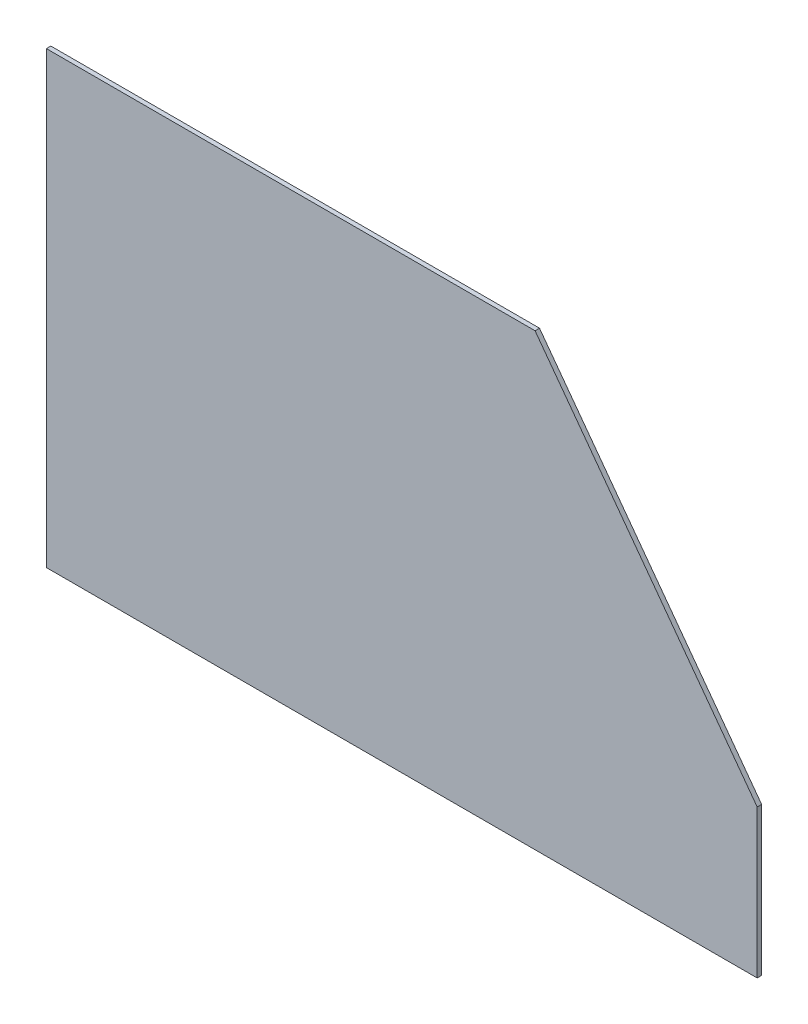
ISO-10303-21;
HEADER;
FILE_DESCRIPTION(('STEP AP214'),'2;1');
FILE_NAME('part.step','',(''),(''),'','','');
FILE_SCHEMA(('AUTOMOTIVE_DESIGN { 1 0 10303 214 1 1 1 1 }'));
ENDSEC;
DATA;
#1=APPLICATION_CONTEXT('core data for automotive mechanical design processes');
#2=APPLICATION_PROTOCOL_DEFINITION('international standard','automotive_design',2000,#1);
#3=PRODUCT_CONTEXT('',#1,'mechanical');
#4=PRODUCT('Part','Part','',(#3));
#5=PRODUCT_RELATED_PRODUCT_CATEGORY('part','',(#4));
#6=PRODUCT_DEFINITION_FORMATION('','',#4);
#7=PRODUCT_DEFINITION_CONTEXT('part definition',#1,'design');
#8=PRODUCT_DEFINITION('design','',#6,#7);
#9=PRODUCT_DEFINITION_SHAPE('','',#8);
#10=(LENGTH_UNIT() NAMED_UNIT(*) SI_UNIT(.MILLI.,.METRE.));
#11=(NAMED_UNIT(*) PLANE_ANGLE_UNIT() SI_UNIT($,.RADIAN.));
#12=(NAMED_UNIT(*) SI_UNIT($,.STERADIAN.) SOLID_ANGLE_UNIT());
#13=UNCERTAINTY_MEASURE_WITH_UNIT(LENGTH_MEASURE(1.E-05),#10,'distance_accuracy_value','');
#14=(GEOMETRIC_REPRESENTATION_CONTEXT(3) GLOBAL_UNCERTAINTY_ASSIGNED_CONTEXT((#13)) GLOBAL_UNIT_ASSIGNED_CONTEXT((#10,
#11,#12)) REPRESENTATION_CONTEXT('',''));
#15=CARTESIAN_POINT('',(0.,0.,0.));
#16=DIRECTION('',(0.,0.,1.));
#17=DIRECTION('',(1.,0.,0.));
#18=AXIS2_PLACEMENT_3D('',#15,#16,#17);
#19=CARTESIAN_POINT('',(0.,303.5,3.));
#20=DIRECTION('',(1.,0.,0.));
#21=DIRECTION('',(0.,1.,0.));
#22=AXIS2_PLACEMENT_3D('',#19,#20,#21);
#23=PLANE('',#22);
#24=DIRECTION('',(0.,-1.,0.));
#25=VECTOR('',#24,1.);
#26=CARTESIAN_POINT('',(0.,303.5,0.));
#27=LINE('',#26,#25);
#28=CARTESIAN_POINT('',(0.,303.5,0.));
#29=VERTEX_POINT('',#28);
#30=CARTESIAN_POINT('',(0.,0.,0.));
#31=VERTEX_POINT('',#30);
#32=EDGE_CURVE('E118',#29,#31,#27,.T.);
#33=ORIENTED_EDGE('',*,*,#32,.T.);
#34=DIRECTION('',(0.,0.,-1.));
#35=VECTOR('',#34,1.);
#36=CARTESIAN_POINT('',(0.,0.,3.));
#37=LINE('',#36,#35);
#38=CARTESIAN_POINT('',(0.,0.,3.));
#39=VERTEX_POINT('',#38);
#40=EDGE_CURVE('E11',#39,#31,#37,.T.);
#41=ORIENTED_EDGE('',*,*,#40,.F.);
#42=DIRECTION('',(0.,-1.,0.));
#43=VECTOR('',#42,1.);
#44=CARTESIAN_POINT('',(0.,303.5,3.));
#45=LINE('',#44,#43);
#46=CARTESIAN_POINT('',(0.,303.5,3.));
#47=VERTEX_POINT('',#46);
#48=EDGE_CURVE('E131',#47,#39,#45,.T.);
#49=ORIENTED_EDGE('',*,*,#48,.F.);
#50=DIRECTION('',(0.,0.,-1.));
#51=VECTOR('',#50,1.);
#52=CARTESIAN_POINT('',(0.,303.5,3.));
#53=LINE('',#52,#51);
#54=EDGE_CURVE('E114',#47,#29,#53,.T.);
#55=ORIENTED_EDGE('',*,*,#54,.T.);
#56=EDGE_LOOP('',(#33,#41,#49,#55));
#57=FACE_BOUND('',#56,.T.);
#58=ADVANCED_FACE('F39',(#57),#23,.F.);
#59=CARTESIAN_POINT('',(0.,0.,3.));
#60=DIRECTION('',(0.,1.,0.));
#61=DIRECTION('',(0.,0.,1.));
#62=AXIS2_PLACEMENT_3D('',#59,#60,#61);
#63=PLANE('',#62);
#64=DIRECTION('',(1.,0.,0.));
#65=VECTOR('',#64,1.);
#66=CARTESIAN_POINT('',(0.,0.,0.));
#67=LINE('',#66,#65);
#68=CARTESIAN_POINT('',(480.,0.,0.));
#69=VERTEX_POINT('',#68);
#70=EDGE_CURVE('E122',#31,#69,#67,.T.);
#71=ORIENTED_EDGE('',*,*,#70,.T.);
#72=DIRECTION('',(0.,0.,-1.));
#73=VECTOR('',#72,1.);
#74=CARTESIAN_POINT('',(480.,0.,3.));
#75=LINE('',#74,#73);
#76=CARTESIAN_POINT('',(480.,0.,3.));
#77=VERTEX_POINT('',#76);
#78=EDGE_CURVE('E48',#77,#69,#75,.T.);
#79=ORIENTED_EDGE('',*,*,#78,.F.);
#80=DIRECTION('',(1.,0.,0.));
#81=VECTOR('',#80,1.);
#82=CARTESIAN_POINT('',(0.,0.,3.));
#83=LINE('',#82,#81);
#84=EDGE_CURVE('E90',#39,#77,#83,.T.);
#85=ORIENTED_EDGE('',*,*,#84,.F.);
#86=ORIENTED_EDGE('',*,*,#40,.T.);
#87=EDGE_LOOP('',(#71,#79,#85,#86));
#88=FACE_BOUND('',#87,.T.);
#89=ADVANCED_FACE('F153',(#88),#63,.F.);
#90=CARTESIAN_POINT('',(480.,0.,3.));
#91=DIRECTION('',(-1.,0.,0.));
#92=DIRECTION('',(0.,0.,1.));
#93=AXIS2_PLACEMENT_3D('',#90,#91,#92);
#94=PLANE('',#93);
#95=DIRECTION('',(0.,1.,0.));
#96=VECTOR('',#95,1.);
#97=CARTESIAN_POINT('',(480.,0.,0.));
#98=LINE('',#97,#96);
#99=CARTESIAN_POINT('',(480.,100.,0.));
#100=VERTEX_POINT('',#99);
#101=EDGE_CURVE('E106',#69,#100,#98,.T.);
#102=ORIENTED_EDGE('',*,*,#101,.T.);
#103=DIRECTION('',(0.,0.,-1.));
#104=VECTOR('',#103,1.);
#105=CARTESIAN_POINT('',(480.,100.,3.));
#106=LINE('',#105,#104);
#107=CARTESIAN_POINT('',(480.,100.,3.));
#108=VERTEX_POINT('',#107);
#109=EDGE_CURVE('E103',#108,#100,#106,.T.);
#110=ORIENTED_EDGE('',*,*,#109,.F.);
#111=DIRECTION('',(0.,1.,0.));
#112=VECTOR('',#111,1.);
#113=CARTESIAN_POINT('',(480.,0.,3.));
#114=LINE('',#113,#112);
#115=EDGE_CURVE('E94',#77,#108,#114,.T.);
#116=ORIENTED_EDGE('',*,*,#115,.F.);
#117=ORIENTED_EDGE('',*,*,#78,.T.);
#118=EDGE_LOOP('',(#102,#110,#116,#117));
#119=FACE_BOUND('',#118,.T.);
#120=ADVANCED_FACE('F104',(#119),#94,.F.);
#121=CARTESIAN_POINT('',(480.,100.,3.));
#122=DIRECTION('',(-0.804956404437189,-0.593333959044611,0.));
#123=DIRECTION('',(0.593333959044611,-0.804956404437189,0.));
#124=AXIS2_PLACEMENT_3D('',#121,#122,#123);
#125=PLANE('',#124);
#126=DIRECTION('',(-0.593333959044611,0.804956404437189,0.));
#127=VECTOR('',#126,1.);
#128=CARTESIAN_POINT('',(480.,100.,0.));
#129=LINE('',#128,#127);
#130=CARTESIAN_POINT('',(330.,303.5,0.));
#131=VERTEX_POINT('',#130);
#132=EDGE_CURVE('E76',#100,#131,#129,.T.);
#133=ORIENTED_EDGE('',*,*,#132,.T.);
#134=DIRECTION('',(0.,0.,-1.));
#135=VECTOR('',#134,1.);
#136=CARTESIAN_POINT('',(330.,303.5,3.));
#137=LINE('',#136,#135);
#138=CARTESIAN_POINT('',(330.,303.5,3.));
#139=VERTEX_POINT('',#138);
#140=EDGE_CURVE('E108',#139,#131,#137,.T.);
#141=ORIENTED_EDGE('',*,*,#140,.F.);
#142=DIRECTION('',(-0.593333959044611,0.804956404437189,0.));
#143=VECTOR('',#142,1.);
#144=CARTESIAN_POINT('',(480.,100.,3.));
#145=LINE('',#144,#143);
#146=EDGE_CURVE('E98',#108,#139,#145,.T.);
#147=ORIENTED_EDGE('',*,*,#146,.F.);
#148=ORIENTED_EDGE('',*,*,#109,.T.);
#149=EDGE_LOOP('',(#133,#141,#147,#148));
#150=FACE_BOUND('',#149,.T.);
#151=ADVANCED_FACE('F110',(#150),#125,.F.);
#152=CARTESIAN_POINT('',(330.,303.5,3.));
#153=DIRECTION('',(0.,-1.,0.));
#154=DIRECTION('',(0.,0.,-1.));
#155=AXIS2_PLACEMENT_3D('',#152,#153,#154);
#156=PLANE('',#155);
#157=DIRECTION('',(-1.,0.,0.));
#158=VECTOR('',#157,1.);
#159=CARTESIAN_POINT('',(330.,303.5,0.));
#160=LINE('',#159,#158);
#161=EDGE_CURVE('E82',#131,#29,#160,.T.);
#162=ORIENTED_EDGE('',*,*,#161,.T.);
#163=ORIENTED_EDGE('',*,*,#54,.F.);
#164=DIRECTION('',(-1.,0.,0.));
#165=VECTOR('',#164,1.);
#166=CARTESIAN_POINT('',(330.,303.5,3.));
#167=LINE('',#166,#165);
#168=EDGE_CURVE('E56',#139,#47,#167,.T.);
#169=ORIENTED_EDGE('',*,*,#168,.F.);
#170=ORIENTED_EDGE('',*,*,#140,.T.);
#171=EDGE_LOOP('',(#162,#163,#169,#170));
#172=FACE_BOUND('',#171,.T.);
#173=ADVANCED_FACE('F142',(#172),#156,.F.);
#174=CARTESIAN_POINT('',(0.,0.,3.));
#175=DIRECTION('',(0.,0.,1.));
#176=DIRECTION('',(1.,0.,0.));
#177=AXIS2_PLACEMENT_3D('',#174,#175,#176);
#178=PLANE('',#177);
#179=ORIENTED_EDGE('',*,*,#48,.T.);
#180=ORIENTED_EDGE('',*,*,#84,.T.);
#181=ORIENTED_EDGE('',*,*,#115,.T.);
#182=ORIENTED_EDGE('',*,*,#146,.T.);
#183=ORIENTED_EDGE('',*,*,#168,.T.);
#184=EDGE_LOOP('',(#179,#180,#181,#182,#183));
#185=FACE_BOUND('',#184,.T.);
#186=ADVANCED_FACE('F96',(#185),#178,.T.);
#187=CARTESIAN_POINT('',(0.,0.,0.));
#188=DIRECTION('',(0.,0.,1.));
#189=DIRECTION('',(1.,0.,0.));
#190=AXIS2_PLACEMENT_3D('',#187,#188,#189);
#191=PLANE('',#190);
#192=ORIENTED_EDGE('',*,*,#32,.F.);
#193=ORIENTED_EDGE('',*,*,#161,.F.);
#194=ORIENTED_EDGE('',*,*,#132,.F.);
#195=ORIENTED_EDGE('',*,*,#101,.F.);
#196=ORIENTED_EDGE('',*,*,#70,.F.);
#197=EDGE_LOOP('',(#192,#193,#194,#195,#196));
#198=FACE_BOUND('',#197,.T.);
#199=ADVANCED_FACE('F138',(#198),#191,.F.);
#200=CLOSED_SHELL('',(#58,#89,#120,#151,#173,#186,#199));
#201=MANIFOLD_SOLID_BREP('B2',#200);
#202=ADVANCED_BREP_SHAPE_REPRESENTATION('',(#18,#201),#14);
#203=SHAPE_DEFINITION_REPRESENTATION(#9,#202);
ENDSEC;
END-ISO-10303-21;
